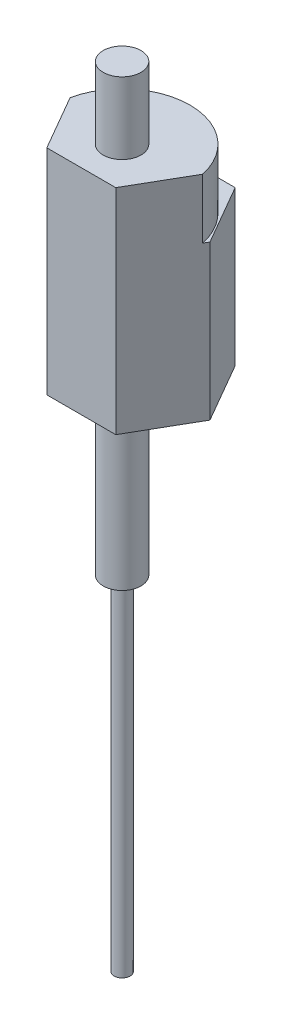
ISO-10303-21;
HEADER;
FILE_DESCRIPTION(('STEP AP214'),'2;1');
FILE_NAME('part.step','',(''),(''),'','','');
FILE_SCHEMA(('AUTOMOTIVE_DESIGN { 1 0 10303 214 1 1 1 1 }'));
ENDSEC;
DATA;
#1=APPLICATION_CONTEXT('core data for automotive mechanical design processes');
#2=APPLICATION_PROTOCOL_DEFINITION('international standard','automotive_design',2000,#1);
#3=PRODUCT_CONTEXT('',#1,'mechanical');
#4=PRODUCT('Part','Part','',(#3));
#5=PRODUCT_RELATED_PRODUCT_CATEGORY('part','',(#4));
#6=PRODUCT_DEFINITION_FORMATION('','',#4);
#7=PRODUCT_DEFINITION_CONTEXT('part definition',#1,'design');
#8=PRODUCT_DEFINITION('design','',#6,#7);
#9=PRODUCT_DEFINITION_SHAPE('','',#8);
#10=(LENGTH_UNIT() NAMED_UNIT(*) SI_UNIT(.MILLI.,.METRE.));
#11=(NAMED_UNIT(*) PLANE_ANGLE_UNIT() SI_UNIT($,.RADIAN.));
#12=(NAMED_UNIT(*) SI_UNIT($,.STERADIAN.) SOLID_ANGLE_UNIT());
#13=UNCERTAINTY_MEASURE_WITH_UNIT(LENGTH_MEASURE(1.E-05),#10,'distance_accuracy_value','');
#14=(GEOMETRIC_REPRESENTATION_CONTEXT(3) GLOBAL_UNCERTAINTY_ASSIGNED_CONTEXT((#13)) GLOBAL_UNIT_ASSIGNED_CONTEXT((#10,
#11,#12)) REPRESENTATION_CONTEXT('',''));
#15=CARTESIAN_POINT('',(0.,0.,0.));
#16=DIRECTION('',(0.,0.,1.));
#17=DIRECTION('',(1.,0.,0.));
#18=AXIS2_PLACEMENT_3D('',#15,#16,#17);
#19=CARTESIAN_POINT('',(0.,-16.,1.9));
#20=DIRECTION('',(0.,-1.,0.));
#21=DIRECTION('',(0.,0.,-1.));
#22=AXIS2_PLACEMENT_3D('',#19,#20,#21);
#23=PLANE('',#22);
#24=CARTESIAN_POINT('',(0.,-16.,1.9));
#25=DIRECTION('',(0.,-1.,0.));
#26=DIRECTION('',(0.,0.,-1.));
#27=AXIS2_PLACEMENT_3D('',#24,#25,#26);
#28=CIRCLE('',#27,1.9);
#29=CARTESIAN_POINT('',(0.,-16.,0.));
#30=VERTEX_POINT('',#29);
#31=EDGE_CURVE('E195',#30,#30,#28,.T.);
#32=ORIENTED_EDGE('',*,*,#31,.T.);
#33=EDGE_LOOP('',(#32));
#34=FACE_BOUND('',#33,.T.);
#35=CARTESIAN_POINT('',(0.,-16.,1.9));
#36=DIRECTION('',(0.,-1.,0.));
#37=DIRECTION('',(0.,0.,-1.));
#38=AXIS2_PLACEMENT_3D('',#35,#36,#37);
#39=CIRCLE('',#38,0.8);
#40=CARTESIAN_POINT('',(0.,-16.,1.1));
#41=VERTEX_POINT('',#40);
#42=EDGE_CURVE('E209',#41,#41,#39,.T.);
#43=ORIENTED_EDGE('',*,*,#42,.F.);
#44=EDGE_LOOP('',(#43));
#45=FACE_BOUND('',#44,.T.);
#46=ADVANCED_FACE('F33',(#34,#45),#23,.T.);
#47=CARTESIAN_POINT('',(0.,0.,0.));
#48=DIRECTION('',(0.,1.,0.));
#49=DIRECTION('',(0.,0.,1.));
#50=AXIS2_PLACEMENT_3D('',#47,#48,#49);
#51=PLANE('',#50);
#52=DIRECTION('',(-0.5,0.,0.866025403784439));
#53=VECTOR('',#52,1.);
#54=CARTESIAN_POINT('',(-3.46410161513776,0.,-6.00000000000001));
#55=LINE('',#54,#53);
#56=CARTESIAN_POINT('',(-3.46410161513776,0.,-6.00000000000001));
#57=VERTEX_POINT('',#56);
#58=CARTESIAN_POINT('',(-6.92820323027551,0.,0.));
#59=VERTEX_POINT('',#58);
#60=EDGE_CURVE('E87',#57,#59,#55,.T.);
#61=ORIENTED_EDGE('',*,*,#60,.F.);
#62=DIRECTION('',(-1.,0.,0.));
#63=VECTOR('',#62,1.);
#64=CARTESIAN_POINT('',(3.46410161513776,0.,-6.));
#65=LINE('',#64,#63);
#66=CARTESIAN_POINT('',(3.46410161513776,0.,-6.));
#67=VERTEX_POINT('',#66);
#68=EDGE_CURVE('E96',#67,#57,#65,.T.);
#69=ORIENTED_EDGE('',*,*,#68,.F.);
#70=DIRECTION('',(-0.5,0.,-0.866025403784439));
#71=VECTOR('',#70,1.);
#72=CARTESIAN_POINT('',(6.9282032302755,0.,0.));
#73=LINE('',#72,#71);
#74=CARTESIAN_POINT('',(6.9282032302755,0.,0.));
#75=VERTEX_POINT('',#74);
#76=EDGE_CURVE('E103',#75,#67,#73,.T.);
#77=ORIENTED_EDGE('',*,*,#76,.F.);
#78=DIRECTION('',(0.5,0.,-0.866025403784439));
#79=VECTOR('',#78,1.);
#80=CARTESIAN_POINT('',(3.46410161513775,0.,6.));
#81=LINE('',#80,#79);
#82=CARTESIAN_POINT('',(3.46410161513775,0.,6.));
#83=VERTEX_POINT('',#82);
#84=EDGE_CURVE('E121',#83,#75,#81,.T.);
#85=ORIENTED_EDGE('',*,*,#84,.F.);
#86=DIRECTION('',(1.,0.,0.));
#87=VECTOR('',#86,1.);
#88=CARTESIAN_POINT('',(-3.46410161513776,0.,6.));
#89=LINE('',#88,#87);
#90=CARTESIAN_POINT('',(-3.46410161513776,0.,6.));
#91=VERTEX_POINT('',#90);
#92=EDGE_CURVE('E112',#91,#83,#89,.T.);
#93=ORIENTED_EDGE('',*,*,#92,.F.);
#94=DIRECTION('',(0.5,0.,0.866025403784439));
#95=VECTOR('',#94,1.);
#96=CARTESIAN_POINT('',(-6.92820323027551,0.,0.));
#97=LINE('',#96,#95);
#98=EDGE_CURVE('E109',#59,#91,#97,.T.);
#99=ORIENTED_EDGE('',*,*,#98,.F.);
#100=EDGE_LOOP('',(#61,#69,#77,#85,#93,#99));
#101=FACE_BOUND('',#100,.T.);
#102=CARTESIAN_POINT('',(0.,0.,1.9));
#103=DIRECTION('',(0.,1.,0.));
#104=DIRECTION('',(0.,0.,1.));
#105=AXIS2_PLACEMENT_3D('',#102,#103,#104);
#106=CIRCLE('',#105,1.9);
#107=CARTESIAN_POINT('',(0.,0.,3.8));
#108=VERTEX_POINT('',#107);
#109=EDGE_CURVE('E41',#108,#108,#106,.F.);
#110=ORIENTED_EDGE('',*,*,#109,.F.);
#111=EDGE_LOOP('',(#110));
#112=FACE_BOUND('',#111,.T.);
#113=ADVANCED_FACE('F106',(#101,#112),#51,.F.);
#114=CARTESIAN_POINT('',(-3.46410161513776,21.5,-6.00000000000001));
#115=DIRECTION('',(0.866025403784439,0.,0.5));
#116=DIRECTION('',(0.5,0.,-0.866025403784439));
#117=AXIS2_PLACEMENT_3D('',#114,#115,#116);
#118=PLANE('',#117);
#119=DIRECTION('',(-0.5,0.,0.866025403784439));
#120=VECTOR('',#119,1.);
#121=CARTESIAN_POINT('',(-6.92820323027551,15.5,0.));
#122=LINE('',#121,#120);
#123=CARTESIAN_POINT('',(-3.46410161513776,15.5,-6.00000000000001));
#124=VERTEX_POINT('',#123);
#125=CARTESIAN_POINT('',(-6.92820323027551,15.5,0.));
#126=VERTEX_POINT('',#125);
#127=EDGE_CURVE('E90',#124,#126,#122,.T.);
#128=ORIENTED_EDGE('',*,*,#127,.F.);
#129=DIRECTION('',(0.,-1.,0.));
#130=VECTOR('',#129,1.);
#131=CARTESIAN_POINT('',(-3.46410161513776,21.5,-6.00000000000001));
#132=LINE('',#131,#130);
#133=EDGE_CURVE('E83',#124,#57,#132,.T.);
#134=ORIENTED_EDGE('',*,*,#133,.T.);
#135=ORIENTED_EDGE('',*,*,#60,.T.);
#136=DIRECTION('',(0.,-1.,0.));
#137=VECTOR('',#136,1.);
#138=CARTESIAN_POINT('',(-6.92820323027551,21.5,0.));
#139=LINE('',#138,#137);
#140=EDGE_CURVE('E134',#126,#59,#139,.T.);
#141=ORIENTED_EDGE('',*,*,#140,.F.);
#142=EDGE_LOOP('',(#128,#134,#135,#141));
#143=FACE_BOUND('',#142,.T.);
#144=ADVANCED_FACE('F35',(#143),#118,.F.);
#145=CARTESIAN_POINT('',(6.9282032302755,21.5,0.));
#146=DIRECTION('',(-0.866025403784439,0.,0.5));
#147=DIRECTION('',(0.5,0.,0.866025403784439));
#148=AXIS2_PLACEMENT_3D('',#145,#146,#147);
#149=PLANE('',#148);
#150=DIRECTION('',(-0.5,0.,-0.866025403784439));
#151=VECTOR('',#150,1.);
#152=CARTESIAN_POINT('',(3.46410161513776,15.5,-6.));
#153=LINE('',#152,#151);
#154=CARTESIAN_POINT('',(6.9282032302755,15.5,0.));
#155=VERTEX_POINT('',#154);
#156=CARTESIAN_POINT('',(3.46410161513776,15.5,-6.));
#157=VERTEX_POINT('',#156);
#158=EDGE_CURVE('E48',#155,#157,#153,.T.);
#159=ORIENTED_EDGE('',*,*,#158,.F.);
#160=DIRECTION('',(0.,-1.,0.));
#161=VECTOR('',#160,1.);
#162=CARTESIAN_POINT('',(6.9282032302755,21.5,0.));
#163=LINE('',#162,#161);
#164=EDGE_CURVE('E126',#155,#75,#163,.T.);
#165=ORIENTED_EDGE('',*,*,#164,.T.);
#166=ORIENTED_EDGE('',*,*,#76,.T.);
#167=DIRECTION('',(0.,-1.,0.));
#168=VECTOR('',#167,1.);
#169=CARTESIAN_POINT('',(3.46410161513776,21.5,-6.));
#170=LINE('',#169,#168);
#171=EDGE_CURVE('E92',#157,#67,#170,.T.);
#172=ORIENTED_EDGE('',*,*,#171,.F.);
#173=EDGE_LOOP('',(#159,#165,#166,#172));
#174=FACE_BOUND('',#173,.T.);
#175=ADVANCED_FACE('F145',(#174),#149,.F.);
#176=CARTESIAN_POINT('',(3.46410161513776,21.5,-6.));
#177=DIRECTION('',(0.,0.,1.));
#178=DIRECTION('',(1.,0.,0.));
#179=AXIS2_PLACEMENT_3D('',#176,#177,#178);
#180=PLANE('',#179);
#181=DIRECTION('',(-1.,0.,0.));
#182=VECTOR('',#181,1.);
#183=CARTESIAN_POINT('',(-3.46410161513776,15.5,-6.00000000000001));
#184=LINE('',#183,#182);
#185=EDGE_CURVE('E199',#157,#124,#184,.T.);
#186=ORIENTED_EDGE('',*,*,#185,.F.);
#187=ORIENTED_EDGE('',*,*,#171,.T.);
#188=ORIENTED_EDGE('',*,*,#68,.T.);
#189=ORIENTED_EDGE('',*,*,#133,.F.);
#190=EDGE_LOOP('',(#186,#187,#188,#189));
#191=FACE_BOUND('',#190,.T.);
#192=ADVANCED_FACE('F97',(#191),#180,.F.);
#193=CARTESIAN_POINT('',(0.,21.5,0.));
#194=DIRECTION('',(0.,1.,0.));
#195=DIRECTION('',(0.,0.,1.));
#196=AXIS2_PLACEMENT_3D('',#193,#194,#195);
#197=PLANE('',#196);
#198=CARTESIAN_POINT('',(0.,21.5,1.9));
#199=DIRECTION('',(0.,-1.,0.));
#200=DIRECTION('',(0.,0.,1.));
#201=AXIS2_PLACEMENT_3D('',#198,#199,#200);
#202=CIRCLE('',#201,6.81501525470458);
#203=CARTESIAN_POINT('',(-6.66154612490223,21.5,0.461863654705769));
#204=VERTEX_POINT('',#203);
#205=CARTESIAN_POINT('',(6.66154612490223,21.5,0.461863654705756));
#206=VERTEX_POINT('',#205);
#207=EDGE_CURVE('E191',#204,#206,#202,.T.);
#208=ORIENTED_EDGE('',*,*,#207,.F.);
#209=DIRECTION('',(0.5,0.,0.866025403784439));
#210=VECTOR('',#209,1.);
#211=CARTESIAN_POINT('',(-6.92820323027551,21.5,0.));
#212=LINE('',#211,#210);
#213=CARTESIAN_POINT('',(-3.46410161513776,21.5,6.));
#214=VERTEX_POINT('',#213);
#215=EDGE_CURVE('E102',#204,#214,#212,.T.);
#216=ORIENTED_EDGE('',*,*,#215,.T.);
#217=DIRECTION('',(1.,0.,0.));
#218=VECTOR('',#217,1.);
#219=CARTESIAN_POINT('',(-3.46410161513776,21.5,6.));
#220=LINE('',#219,#218);
#221=CARTESIAN_POINT('',(3.46410161513775,21.5,6.));
#222=VERTEX_POINT('',#221);
#223=EDGE_CURVE('E57',#214,#222,#220,.T.);
#224=ORIENTED_EDGE('',*,*,#223,.T.);
#225=DIRECTION('',(0.5,0.,-0.866025403784439));
#226=VECTOR('',#225,1.);
#227=CARTESIAN_POINT('',(3.46410161513775,21.5,6.));
#228=LINE('',#227,#226);
#229=EDGE_CURVE('E93',#222,#206,#228,.T.);
#230=ORIENTED_EDGE('',*,*,#229,.T.);
#231=EDGE_LOOP('',(#208,#216,#224,#230));
#232=FACE_BOUND('',#231,.T.);
#233=CARTESIAN_POINT('',(0.,21.5,1.9));
#234=DIRECTION('',(0.,1.,0.));
#235=DIRECTION('',(0.,0.,1.));
#236=AXIS2_PLACEMENT_3D('',#233,#234,#235);
#237=CIRCLE('',#236,1.9);
#238=CARTESIAN_POINT('',(0.,21.5,3.8));
#239=VERTEX_POINT('',#238);
#240=EDGE_CURVE('E115',#239,#239,#237,.T.);
#241=ORIENTED_EDGE('',*,*,#240,.F.);
#242=EDGE_LOOP('',(#241));
#243=FACE_BOUND('',#242,.T.);
#244=ADVANCED_FACE('F151',(#232,#243),#197,.T.);
#245=CARTESIAN_POINT('',(-6.92820323027551,21.5,0.));
#246=DIRECTION('',(0.866025403784439,0.,-0.5));
#247=DIRECTION('',(-0.5,0.,-0.866025403784439));
#248=AXIS2_PLACEMENT_3D('',#245,#246,#247);
#249=PLANE('',#248);
#250=ORIENTED_EDGE('',*,*,#215,.F.);
#251=DIRECTION('',(0.,1.,0.));
#252=VECTOR('',#251,1.);
#253=CARTESIAN_POINT('',(-6.66154612490223,15.5,0.461863654705769));
#254=LINE('',#253,#252);
#255=CARTESIAN_POINT('',(-6.66154612490223,15.5,0.461863654705769));
#256=VERTEX_POINT('',#255);
#257=EDGE_CURVE('E178',#256,#204,#254,.T.);
#258=ORIENTED_EDGE('',*,*,#257,.F.);
#259=DIRECTION('',(0.500000000000003,0.,0.866025403784437));
#260=VECTOR('',#259,1.);
#261=CARTESIAN_POINT('',(-6.66154612490223,15.5,0.461863654705769));
#262=LINE('',#261,#260);
#263=EDGE_CURVE('E189',#126,#256,#262,.T.);
#264=ORIENTED_EDGE('',*,*,#263,.F.);
#265=ORIENTED_EDGE('',*,*,#140,.T.);
#266=ORIENTED_EDGE('',*,*,#98,.T.);
#267=DIRECTION('',(0.,-1.,0.));
#268=VECTOR('',#267,1.);
#269=CARTESIAN_POINT('',(-3.46410161513776,21.5,6.));
#270=LINE('',#269,#268);
#271=EDGE_CURVE('E131',#214,#91,#270,.T.);
#272=ORIENTED_EDGE('',*,*,#271,.F.);
#273=EDGE_LOOP('',(#250,#258,#264,#265,#266,#272));
#274=FACE_BOUND('',#273,.T.);
#275=ADVANCED_FACE('F165',(#274),#249,.F.);
#276=CARTESIAN_POINT('',(-3.46410161513776,21.5,6.));
#277=DIRECTION('',(0.,0.,-1.));
#278=DIRECTION('',(-1.,0.,0.));
#279=AXIS2_PLACEMENT_3D('',#276,#277,#278);
#280=PLANE('',#279);
#281=ORIENTED_EDGE('',*,*,#92,.T.);
#282=DIRECTION('',(0.,-1.,0.));
#283=VECTOR('',#282,1.);
#284=CARTESIAN_POINT('',(3.46410161513775,21.5,6.));
#285=LINE('',#284,#283);
#286=EDGE_CURVE('E128',#222,#83,#285,.T.);
#287=ORIENTED_EDGE('',*,*,#286,.F.);
#288=ORIENTED_EDGE('',*,*,#223,.F.);
#289=ORIENTED_EDGE('',*,*,#271,.T.);
#290=EDGE_LOOP('',(#281,#287,#288,#289));
#291=FACE_BOUND('',#290,.T.);
#292=ADVANCED_FACE('F162',(#291),#280,.F.);
#293=CARTESIAN_POINT('',(3.46410161513775,21.5,6.));
#294=DIRECTION('',(-0.866025403784439,0.,-0.5));
#295=DIRECTION('',(-0.5,0.,0.866025403784439));
#296=AXIS2_PLACEMENT_3D('',#293,#294,#295);
#297=PLANE('',#296);
#298=DIRECTION('',(0.499999999999999,0.,-0.866025403784439));
#299=VECTOR('',#298,1.);
#300=CARTESIAN_POINT('',(6.9282032302755,15.5,0.));
#301=LINE('',#300,#299);
#302=CARTESIAN_POINT('',(6.66154612490223,15.5,0.461863654705756));
#303=VERTEX_POINT('',#302);
#304=EDGE_CURVE('E202',#303,#155,#301,.T.);
#305=ORIENTED_EDGE('',*,*,#304,.F.);
#306=DIRECTION('',(0.,1.,0.));
#307=VECTOR('',#306,1.);
#308=CARTESIAN_POINT('',(6.66154612490223,15.5,0.461863654705756));
#309=LINE('',#308,#307);
#310=EDGE_CURVE('E186',#303,#206,#309,.T.);
#311=ORIENTED_EDGE('',*,*,#310,.T.);
#312=ORIENTED_EDGE('',*,*,#229,.F.);
#313=ORIENTED_EDGE('',*,*,#286,.T.);
#314=ORIENTED_EDGE('',*,*,#84,.T.);
#315=ORIENTED_EDGE('',*,*,#164,.F.);
#316=EDGE_LOOP('',(#305,#311,#312,#313,#314,#315));
#317=FACE_BOUND('',#316,.T.);
#318=ADVANCED_FACE('F158',(#317),#297,.F.);
#319=CARTESIAN_POINT('',(0.,28.7,1.9));
#320=DIRECTION('',(0.,-1.,0.));
#321=DIRECTION('',(0.,0.,-1.));
#322=AXIS2_PLACEMENT_3D('',#319,#320,#321);
#323=CYLINDRICAL_SURFACE('',#322,1.9);
#324=CARTESIAN_POINT('',(0.,28.7,1.9));
#325=DIRECTION('',(0.,1.,0.));
#326=DIRECTION('',(0.,0.,1.));
#327=AXIS2_PLACEMENT_3D('',#324,#325,#326);
#328=CIRCLE('',#327,1.9);
#329=CARTESIAN_POINT('',(0.,28.7,3.8));
#330=VERTEX_POINT('',#329);
#331=EDGE_CURVE('E110',#330,#330,#328,.T.);
#332=ORIENTED_EDGE('',*,*,#331,.F.);
#333=EDGE_LOOP('',(#332));
#334=FACE_BOUND('',#333,.T.);
#335=ORIENTED_EDGE('',*,*,#240,.T.);
#336=EDGE_LOOP('',(#335));
#337=FACE_BOUND('',#336,.T.);
#338=ADVANCED_FACE('F161',(#334,#337),#323,.T.);
#339=CARTESIAN_POINT('',(0.,28.7,1.9));
#340=DIRECTION('',(0.,1.,0.));
#341=DIRECTION('',(0.,0.,1.));
#342=AXIS2_PLACEMENT_3D('',#339,#340,#341);
#343=PLANE('',#342);
#344=ORIENTED_EDGE('',*,*,#331,.T.);
#345=EDGE_LOOP('',(#344));
#346=FACE_BOUND('',#345,.T.);
#347=ADVANCED_FACE('F244',(#346),#343,.T.);
#348=CARTESIAN_POINT('',(0.,15.5,1.9));
#349=DIRECTION('',(0.,1.,0.));
#350=DIRECTION('',(0.,0.,1.));
#351=AXIS2_PLACEMENT_3D('',#348,#349,#350);
#352=CYLINDRICAL_SURFACE('',#351,6.81501525470458);
#353=ORIENTED_EDGE('',*,*,#207,.T.);
#354=ORIENTED_EDGE('',*,*,#310,.F.);
#355=CARTESIAN_POINT('',(0.,15.5,1.9));
#356=DIRECTION('',(0.,-1.,0.));
#357=DIRECTION('',(0.,0.,1.));
#358=AXIS2_PLACEMENT_3D('',#355,#356,#357);
#359=CIRCLE('',#358,6.81501525470458);
#360=EDGE_CURVE('E194',#256,#303,#359,.T.);
#361=ORIENTED_EDGE('',*,*,#360,.F.);
#362=ORIENTED_EDGE('',*,*,#257,.T.);
#363=EDGE_LOOP('',(#353,#354,#361,#362));
#364=FACE_BOUND('',#363,.T.);
#365=ADVANCED_FACE('F241',(#364),#352,.T.);
#366=CARTESIAN_POINT('',(0.,15.5,1.9));
#367=DIRECTION('',(0.,1.,0.));
#368=DIRECTION('',(0.,0.,1.));
#369=AXIS2_PLACEMENT_3D('',#366,#367,#368);
#370=PLANE('',#369);
#371=ORIENTED_EDGE('',*,*,#360,.T.);
#372=ORIENTED_EDGE('',*,*,#304,.T.);
#373=ORIENTED_EDGE('',*,*,#158,.T.);
#374=ORIENTED_EDGE('',*,*,#185,.T.);
#375=ORIENTED_EDGE('',*,*,#127,.T.);
#376=ORIENTED_EDGE('',*,*,#263,.T.);
#377=EDGE_LOOP('',(#371,#372,#373,#374,#375,#376));
#378=FACE_BOUND('',#377,.T.);
#379=ADVANCED_FACE('F232',(#378),#370,.T.);
#380=CARTESIAN_POINT('',(0.,-16.,1.9));
#381=DIRECTION('',(0.,1.,0.));
#382=DIRECTION('',(0.,0.,1.));
#383=AXIS2_PLACEMENT_3D('',#380,#381,#382);
#384=CYLINDRICAL_SURFACE('',#383,1.9);
#385=ORIENTED_EDGE('',*,*,#31,.F.);
#386=EDGE_LOOP('',(#385));
#387=FACE_BOUND('',#386,.T.);
#388=ORIENTED_EDGE('',*,*,#109,.T.);
#389=EDGE_LOOP('',(#388));
#390=FACE_BOUND('',#389,.T.);
#391=ADVANCED_FACE('F138',(#387,#390),#384,.T.);
#392=CARTESIAN_POINT('',(0.,-50.5,1.9));
#393=DIRECTION('',(0.,-1.,0.));
#394=DIRECTION('',(0.,0.,-1.));
#395=AXIS2_PLACEMENT_3D('',#392,#393,#394);
#396=PLANE('',#395);
#397=CARTESIAN_POINT('',(0.,-50.5,1.9));
#398=DIRECTION('',(0.,-1.,0.));
#399=DIRECTION('',(0.,0.,-1.));
#400=AXIS2_PLACEMENT_3D('',#397,#398,#399);
#401=CIRCLE('',#400,0.8);
#402=CARTESIAN_POINT('',(0.,-50.5,1.1));
#403=VERTEX_POINT('',#402);
#404=EDGE_CURVE('E208',#403,#403,#401,.T.);
#405=ORIENTED_EDGE('',*,*,#404,.T.);
#406=EDGE_LOOP('',(#405));
#407=FACE_BOUND('',#406,.T.);
#408=CARTESIAN_POINT('',(0.,-50.5,1.9));
#409=DIRECTION('',(0.,-1.,0.));
#410=DIRECTION('',(0.,0.,-1.));
#411=AXIS2_PLACEMENT_3D('',#408,#409,#410);
#412=CIRCLE('',#411,0.65475723438636);
#413=CARTESIAN_POINT('',(0.,-50.5,1.24524276561364));
#414=VERTEX_POINT('',#413);
#415=EDGE_CURVE('E212',#414,#414,#412,.T.);
#416=ORIENTED_EDGE('',*,*,#415,.F.);
#417=EDGE_LOOP('',(#416));
#418=FACE_BOUND('',#417,.T.);
#419=ADVANCED_FACE('F221',(#407,#418),#396,.T.);
#420=CARTESIAN_POINT('',(0.,-50.5,1.9));
#421=DIRECTION('',(0.,1.,0.));
#422=DIRECTION('',(0.,0.,1.));
#423=AXIS2_PLACEMENT_3D('',#420,#421,#422);
#424=CYLINDRICAL_SURFACE('',#423,0.8);
#425=ORIENTED_EDGE('',*,*,#404,.F.);
#426=EDGE_LOOP('',(#425));
#427=FACE_BOUND('',#426,.T.);
#428=ORIENTED_EDGE('',*,*,#42,.T.);
#429=EDGE_LOOP('',(#428));
#430=FACE_BOUND('',#429,.T.);
#431=ADVANCED_FACE('F223',(#427,#430),#424,.T.);
#432=CARTESIAN_POINT('',(0.,-50.5,1.9));
#433=DIRECTION('',(0.,1.,0.));
#434=DIRECTION('',(0.,0.,1.));
#435=AXIS2_PLACEMENT_3D('',#432,#433,#434);
#436=CYLINDRICAL_SURFACE('',#435,0.65475723438636);
#437=ORIENTED_EDGE('',*,*,#415,.T.);
#438=EDGE_LOOP('',(#437));
#439=FACE_BOUND('',#438,.T.);
#440=CARTESIAN_POINT('',(0.,-16.,1.9));
#441=DIRECTION('',(0.,-1.,0.));
#442=DIRECTION('',(0.,0.,-1.));
#443=AXIS2_PLACEMENT_3D('',#440,#441,#442);
#444=CIRCLE('',#443,0.65475723438636);
#445=CARTESIAN_POINT('',(0.,-16.,1.24524276561364));
#446=VERTEX_POINT('',#445);
#447=EDGE_CURVE('E11',#446,#446,#444,.F.);
#448=ORIENTED_EDGE('',*,*,#447,.T.);
#449=EDGE_LOOP('',(#448));
#450=FACE_BOUND('',#449,.T.);
#451=ADVANCED_FACE('F218',(#439,#450),#436,.F.);
#452=ORIENTED_EDGE('',*,*,#447,.F.);
#453=EDGE_LOOP('',(#452));
#454=FACE_BOUND('',#453,.T.);
#455=ADVANCED_FACE('F148',(#454),#23,.T.);
#456=CLOSED_SHELL('',(#46,#113,#144,#175,#192,#244,#275,#292,#318,#338,#347,#365,#379,#391,#419,
#431,#451,#455));
#457=MANIFOLD_SOLID_BREP('B2',#456);
#458=ADVANCED_BREP_SHAPE_REPRESENTATION('',(#18,#457),#14);
#459=SHAPE_DEFINITION_REPRESENTATION(#9,#458);
ENDSEC;
END-ISO-10303-21;
